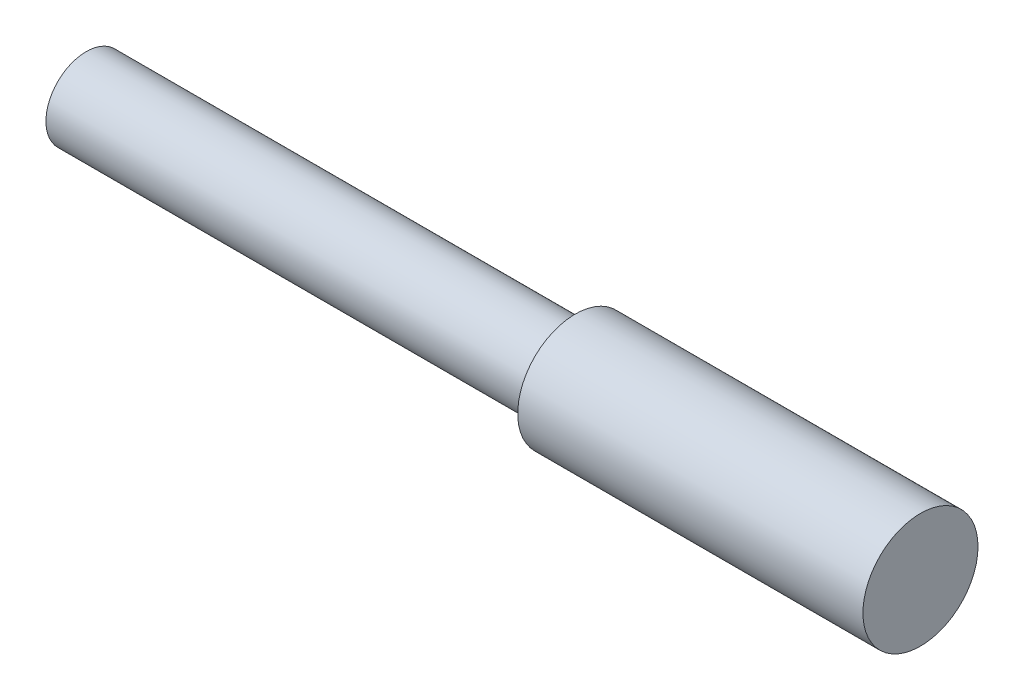
ISO-10303-21;
HEADER;
FILE_DESCRIPTION(('STEP AP214'),'2;1');
FILE_NAME('part.step','',(''),(''),'','','');
FILE_SCHEMA(('AUTOMOTIVE_DESIGN { 1 0 10303 214 1 1 1 1 }'));
ENDSEC;
DATA;
#1=APPLICATION_CONTEXT('core data for automotive mechanical design processes');
#2=APPLICATION_PROTOCOL_DEFINITION('international standard','automotive_design',2000,#1);
#3=PRODUCT_CONTEXT('',#1,'mechanical');
#4=PRODUCT('Part','Part','',(#3));
#5=PRODUCT_RELATED_PRODUCT_CATEGORY('part','',(#4));
#6=PRODUCT_DEFINITION_FORMATION('','',#4);
#7=PRODUCT_DEFINITION_CONTEXT('part definition',#1,'design');
#8=PRODUCT_DEFINITION('design','',#6,#7);
#9=PRODUCT_DEFINITION_SHAPE('','',#8);
#10=(LENGTH_UNIT() NAMED_UNIT(*) SI_UNIT(.MILLI.,.METRE.));
#11=(NAMED_UNIT(*) PLANE_ANGLE_UNIT() SI_UNIT($,.RADIAN.));
#12=(NAMED_UNIT(*) SI_UNIT($,.STERADIAN.) SOLID_ANGLE_UNIT());
#13=UNCERTAINTY_MEASURE_WITH_UNIT(LENGTH_MEASURE(1.E-05),#10,'distance_accuracy_value','');
#14=(GEOMETRIC_REPRESENTATION_CONTEXT(3) GLOBAL_UNCERTAINTY_ASSIGNED_CONTEXT((#13)) GLOBAL_UNIT_ASSIGNED_CONTEXT((#10,
#11,#12)) REPRESENTATION_CONTEXT('',''));
#15=CARTESIAN_POINT('',(0.,0.,0.));
#16=DIRECTION('',(0.,0.,1.));
#17=DIRECTION('',(1.,0.,0.));
#18=AXIS2_PLACEMENT_3D('',#15,#16,#17);
#19=CARTESIAN_POINT('',(-145.,0.,0.));
#20=DIRECTION('',(1.,0.,0.));
#21=DIRECTION('',(0.,0.,-1.));
#22=AXIS2_PLACEMENT_3D('',#19,#20,#21);
#23=CYLINDRICAL_SURFACE('',#22,10.);
#24=CARTESIAN_POINT('',(-60.,0.,0.));
#25=DIRECTION('',(1.,0.,0.));
#26=DIRECTION('',(0.,0.,-1.));
#27=AXIS2_PLACEMENT_3D('',#24,#25,#26);
#28=CIRCLE('',#27,10.);
#29=CARTESIAN_POINT('',(-60.,0.,-10.));
#30=VERTEX_POINT('',#29);
#31=EDGE_CURVE('E43',#30,#30,#28,.T.);
#32=ORIENTED_EDGE('',*,*,#31,.T.);
#33=EDGE_LOOP('',(#32));
#34=FACE_BOUND('',#33,.T.);
#35=CARTESIAN_POINT('',(0.,0.,0.));
#36=DIRECTION('',(1.,0.,0.));
#37=DIRECTION('',(0.,0.,-1.));
#38=AXIS2_PLACEMENT_3D('',#35,#36,#37);
#39=CIRCLE('',#38,10.);
#40=CARTESIAN_POINT('',(0.,0.,-10.));
#41=VERTEX_POINT('',#40);
#42=EDGE_CURVE('E10',#41,#41,#39,.T.);
#43=ORIENTED_EDGE('',*,*,#42,.F.);
#44=EDGE_LOOP('',(#43));
#45=FACE_BOUND('',#44,.T.);
#46=ADVANCED_FACE('F33',(#34,#45),#23,.T.);
#47=CARTESIAN_POINT('',(0.,0.,0.));
#48=DIRECTION('',(1.,0.,0.));
#49=DIRECTION('',(0.,0.,-1.));
#50=AXIS2_PLACEMENT_3D('',#47,#48,#49);
#51=PLANE('',#50);
#52=ORIENTED_EDGE('',*,*,#42,.T.);
#53=EDGE_LOOP('',(#52));
#54=FACE_BOUND('',#53,.T.);
#55=ADVANCED_FACE('F57',(#54),#51,.T.);
#56=CARTESIAN_POINT('',(-157.,0.,0.));
#57=DIRECTION('',(1.,0.,0.));
#58=DIRECTION('',(0.,0.,-1.));
#59=AXIS2_PLACEMENT_3D('',#56,#57,#58);
#60=CYLINDRICAL_SURFACE('',#59,7.);
#61=CARTESIAN_POINT('',(-60.,0.,0.));
#62=DIRECTION('',(1.,0.,0.));
#63=DIRECTION('',(0.,0.,-1.));
#64=AXIS2_PLACEMENT_3D('',#61,#62,#63);
#65=CIRCLE('',#64,7.);
#66=CARTESIAN_POINT('',(-60.,0.,-7.));
#67=VERTEX_POINT('',#66);
#68=EDGE_CURVE('E47',#67,#67,#65,.T.);
#69=CARTESIAN_POINT('',(-145.,0.,0.));
#70=DIRECTION('',(1.,0.,0.));
#71=DIRECTION('',(0.,0.,-1.));
#72=AXIS2_PLACEMENT_3D('',#69,#70,#71);
#73=CIRCLE('',#72,7.);
#74=CARTESIAN_POINT('',(-145.,0.,-7.));
#75=VERTEX_POINT('',#74);
#76=EDGE_CURVE('E36',#75,#75,#73,.T.);
#77=CARTESIAN_POINT('',(-60.,0.,-7.));
#78=CARTESIAN_POINT('',(-60.8854166666667,0.,-7.));
#79=CARTESIAN_POINT('',(-61.7708333333333,0.,-7.));
#80=CARTESIAN_POINT('',(-63.5416666666667,0.,-7.));
#81=CARTESIAN_POINT('',(-64.4270833333333,0.,-7.));
#82=CARTESIAN_POINT('',(-66.1979166666667,0.,-7.));
#83=CARTESIAN_POINT('',(-67.0833333333333,0.,-7.));
#84=CARTESIAN_POINT('',(-68.8541666666667,0.,-7.));
#85=CARTESIAN_POINT('',(-69.7395833333333,0.,-7.));
#86=CARTESIAN_POINT('',(-71.5104166666667,0.,-7.));
#87=CARTESIAN_POINT('',(-72.3958333333333,0.,-7.));
#88=CARTESIAN_POINT('',(-74.1666666666667,0.,-7.));
#89=CARTESIAN_POINT('',(-75.0520833333333,0.,-7.));
#90=CARTESIAN_POINT('',(-76.8229166666667,0.,-7.));
#91=CARTESIAN_POINT('',(-77.7083333333334,0.,-7.));
#92=CARTESIAN_POINT('',(-79.4791666666667,0.,-7.));
#93=CARTESIAN_POINT('',(-80.3645833333334,0.,-7.));
#94=CARTESIAN_POINT('',(-82.1354166666667,0.,-7.));
#95=CARTESIAN_POINT('',(-83.0208333333333,0.,-7.));
#96=CARTESIAN_POINT('',(-84.7916666666667,0.,-7.));
#97=CARTESIAN_POINT('',(-85.6770833333333,0.,-7.));
#98=CARTESIAN_POINT('',(-87.4479166666667,0.,-7.));
#99=CARTESIAN_POINT('',(-88.3333333333333,0.,-7.));
#100=CARTESIAN_POINT('',(-90.1041666666667,0.,-7.));
#101=CARTESIAN_POINT('',(-90.9895833333333,0.,-7.));
#102=CARTESIAN_POINT('',(-92.7604166666667,0.,-7.));
#103=CARTESIAN_POINT('',(-93.6458333333333,0.,-7.));
#104=CARTESIAN_POINT('',(-95.4166666666667,0.,-7.));
#105=CARTESIAN_POINT('',(-96.3020833333333,0.,-7.));
#106=CARTESIAN_POINT('',(-98.0729166666667,0.,-7.));
#107=CARTESIAN_POINT('',(-98.9583333333333,0.,-7.));
#108=CARTESIAN_POINT('',(-100.729166666667,0.,-7.));
#109=CARTESIAN_POINT('',(-101.614583333333,0.,-7.));
#110=CARTESIAN_POINT('',(-103.385416666667,0.,-7.));
#111=CARTESIAN_POINT('',(-104.270833333333,0.,-7.));
#112=CARTESIAN_POINT('',(-106.041666666667,0.,-7.));
#113=CARTESIAN_POINT('',(-106.927083333333,0.,-7.));
#114=CARTESIAN_POINT('',(-108.697916666667,0.,-7.));
#115=CARTESIAN_POINT('',(-109.583333333333,0.,-7.));
#116=CARTESIAN_POINT('',(-111.354166666667,0.,-7.));
#117=CARTESIAN_POINT('',(-112.239583333333,0.,-7.));
#118=CARTESIAN_POINT('',(-114.010416666667,0.,-7.));
#119=CARTESIAN_POINT('',(-114.895833333333,0.,-7.));
#120=CARTESIAN_POINT('',(-116.666666666667,0.,-7.));
#121=CARTESIAN_POINT('',(-117.552083333333,0.,-7.));
#122=CARTESIAN_POINT('',(-119.322916666667,0.,-7.));
#123=CARTESIAN_POINT('',(-120.208333333333,0.,-7.));
#124=CARTESIAN_POINT('',(-121.979166666667,0.,-7.));
#125=CARTESIAN_POINT('',(-122.864583333333,0.,-7.));
#126=CARTESIAN_POINT('',(-124.635416666667,0.,-7.));
#127=CARTESIAN_POINT('',(-125.520833333333,0.,-7.));
#128=CARTESIAN_POINT('',(-127.291666666667,0.,-7.));
#129=CARTESIAN_POINT('',(-128.177083333333,0.,-7.));
#130=CARTESIAN_POINT('',(-129.947916666667,0.,-7.));
#131=CARTESIAN_POINT('',(-130.833333333333,0.,-7.));
#132=CARTESIAN_POINT('',(-132.604166666667,0.,-7.));
#133=CARTESIAN_POINT('',(-133.489583333333,0.,-7.));
#134=CARTESIAN_POINT('',(-135.260416666667,0.,-7.));
#135=CARTESIAN_POINT('',(-136.145833333333,0.,-7.));
#136=CARTESIAN_POINT('',(-137.916666666667,0.,-7.));
#137=CARTESIAN_POINT('',(-138.802083333333,0.,-7.));
#138=CARTESIAN_POINT('',(-140.572916666667,0.,-7.));
#139=CARTESIAN_POINT('',(-141.458333333333,0.,-7.));
#140=CARTESIAN_POINT('',(-143.229166666667,0.,-7.));
#141=CARTESIAN_POINT('',(-144.114583333333,0.,-7.));
#142=CARTESIAN_POINT('',(-145.,0.,-7.));
#143=B_SPLINE_CURVE_WITH_KNOTS('',3,(#77,#78,#79,#80,#81,#82,#83,#84,#85,#86,#87,#88,#89,#90,
#91,#92,#93,#94,#95,#96,#97,#98,#99,#100,#101,#102,#103,#104,#105,#106,#107,#108,#109,#110,#111,
#112,#113,#114,#115,#116,#117,#118,#119,#120,#121,#122,#123,#124,#125,#126,#127,#128,#129,#130,
#131,#132,#133,#134,#135,#136,#137,#138,#139,#140,#141,#142),.UNSPECIFIED.,.F.,.F.,(4,2,2,2,2,2,
2,2,2,2,2,2,2,2,2,2,2,2,2,2,2,2,2,2,2,2,2,2,2,2,2,2,4),(0.,2.65625,5.3125,7.96875,10.625,
13.28125,15.9375,18.59375,21.25,23.90625,26.5625,29.21875,31.875,34.53125,37.1875,39.84375,42.5,
45.15625,47.8125,50.46875,53.125,55.78125,58.4375,61.09375,63.75,66.40625,69.0625,71.71875,
74.375,77.03125,79.6875,82.34375,85.),.UNSPECIFIED.);
#144=EDGE_CURVE('BSEAM54',#67,#75,#143,.T.);
#145=ORIENTED_EDGE('',*,*,#68,.F.);
#146=ORIENTED_EDGE('',*,*,#76,.T.);
#147=ORIENTED_EDGE('',*,*,#144,.T.);
#148=ORIENTED_EDGE('',*,*,#144,.F.);
#149=EDGE_LOOP('',(#145,#147,#146,#148));
#150=FACE_BOUND('',#149,.T.);
#151=ADVANCED_FACE('F54',(#150),#60,.T.);
#152=CARTESIAN_POINT('',(-60.,0.,0.));
#153=DIRECTION('',(1.,0.,0.));
#154=DIRECTION('',(0.,0.,-1.));
#155=AXIS2_PLACEMENT_3D('',#152,#153,#154);
#156=PLANE('',#155);
#157=ORIENTED_EDGE('',*,*,#68,.T.);
#158=EDGE_LOOP('',(#157));
#159=FACE_BOUND('',#158,.T.);
#160=ORIENTED_EDGE('',*,*,#31,.F.);
#161=EDGE_LOOP('',(#160));
#162=FACE_BOUND('',#161,.T.);
#163=ADVANCED_FACE('F51',(#159,#162),#156,.F.);
#164=CARTESIAN_POINT('',(-145.,0.,0.));
#165=DIRECTION('',(1.,0.,0.));
#166=DIRECTION('',(0.,0.,-1.));
#167=AXIS2_PLACEMENT_3D('',#164,#165,#166);
#168=PLANE('',#167);
#169=ORIENTED_EDGE('',*,*,#76,.F.);
#170=EDGE_LOOP('',(#169));
#171=FACE_BOUND('',#170,.T.);
#172=ADVANCED_FACE('F61',(#171),#168,.F.);
#173=CLOSED_SHELL('',(#46,#55,#151,#163,#172));
#174=MANIFOLD_SOLID_BREP('B2',#173);
#175=ADVANCED_BREP_SHAPE_REPRESENTATION('',(#18,#174),#14);
#176=SHAPE_DEFINITION_REPRESENTATION(#9,#175);
ENDSEC;
END-ISO-10303-21;
